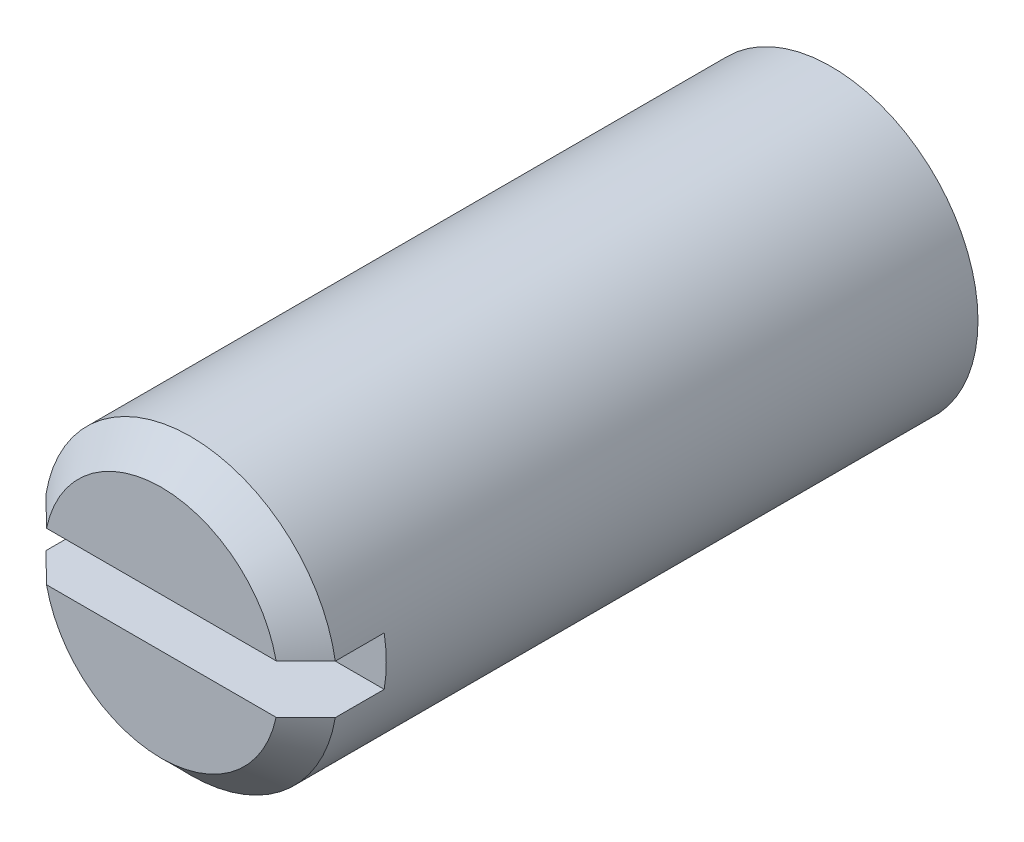
ISO-10303-21;
HEADER;
FILE_DESCRIPTION(('STEP AP214'),'2;1');
FILE_NAME('part.step','',(''),(''),'','','');
FILE_SCHEMA(('AUTOMOTIVE_DESIGN { 1 0 10303 214 1 1 1 1 }'));
ENDSEC;
DATA;
#1=APPLICATION_CONTEXT('core data for automotive mechanical design processes');
#2=APPLICATION_PROTOCOL_DEFINITION('international standard','automotive_design',2000,#1);
#3=PRODUCT_CONTEXT('',#1,'mechanical');
#4=PRODUCT('Part','Part','',(#3));
#5=PRODUCT_RELATED_PRODUCT_CATEGORY('part','',(#4));
#6=PRODUCT_DEFINITION_FORMATION('','',#4);
#7=PRODUCT_DEFINITION_CONTEXT('part definition',#1,'design');
#8=PRODUCT_DEFINITION('design','',#6,#7);
#9=PRODUCT_DEFINITION_SHAPE('','',#8);
#10=(LENGTH_UNIT() NAMED_UNIT(*) SI_UNIT(.MILLI.,.METRE.));
#11=(NAMED_UNIT(*) PLANE_ANGLE_UNIT() SI_UNIT($,.RADIAN.));
#12=(NAMED_UNIT(*) SI_UNIT($,.STERADIAN.) SOLID_ANGLE_UNIT());
#13=UNCERTAINTY_MEASURE_WITH_UNIT(LENGTH_MEASURE(1.E-05),#10,'distance_accuracy_value','');
#14=(GEOMETRIC_REPRESENTATION_CONTEXT(3) GLOBAL_UNCERTAINTY_ASSIGNED_CONTEXT((#13)) GLOBAL_UNIT_ASSIGNED_CONTEXT((#10,
#11,#12)) REPRESENTATION_CONTEXT('',''));
#15=CARTESIAN_POINT('',(0.,0.,0.));
#16=DIRECTION('',(0.,0.,1.));
#17=DIRECTION('',(1.,0.,0.));
#18=AXIS2_PLACEMENT_3D('',#15,#16,#17);
#19=CARTESIAN_POINT('',(0.,0.,0.));
#20=DIRECTION('',(0.,0.,1.));
#21=DIRECTION('',(1.,0.,0.));
#22=AXIS2_PLACEMENT_3D('',#19,#20,#21);
#23=PLANE('',#22);
#24=DIRECTION('',(1.,0.,0.));
#25=VECTOR('',#24,1.);
#26=CARTESIAN_POINT('',(-3.,-0.5,0.));
#27=LINE('',#26,#25);
#28=CARTESIAN_POINT('',(-2.3473389188611,-0.5,0.));
#29=VERTEX_POINT('',#28);
#30=CARTESIAN_POINT('',(2.3473389188611,-0.5,0.));
#31=VERTEX_POINT('',#30);
#32=EDGE_CURVE('E128',#29,#31,#27,.T.);
#33=ORIENTED_EDGE('',*,*,#32,.F.);
#34=CARTESIAN_POINT('',(0.,0.,0.));
#35=DIRECTION('',(0.,0.,1.));
#36=DIRECTION('',(1.,0.,0.));
#37=AXIS2_PLACEMENT_3D('',#34,#35,#36);
#38=CIRCLE('',#37,2.4);
#39=EDGE_CURVE('E173',#29,#31,#38,.T.);
#40=ORIENTED_EDGE('',*,*,#39,.T.);
#41=EDGE_LOOP('',(#33,#40));
#42=FACE_BOUND('',#41,.T.);
#43=ADVANCED_FACE('F35',(#42),#23,.T.);
#44=DIRECTION('',(1.,0.,0.));
#45=VECTOR('',#44,1.);
#46=CARTESIAN_POINT('',(-3.,0.5,0.));
#47=LINE('',#46,#45);
#48=CARTESIAN_POINT('',(-2.3473389188611,0.5,0.));
#49=VERTEX_POINT('',#48);
#50=CARTESIAN_POINT('',(2.3473389188611,0.5,0.));
#51=VERTEX_POINT('',#50);
#52=EDGE_CURVE('E105',#49,#51,#47,.T.);
#53=ORIENTED_EDGE('',*,*,#52,.T.);
#54=CARTESIAN_POINT('',(0.,0.,0.));
#55=DIRECTION('',(0.,0.,1.));
#56=DIRECTION('',(1.,0.,0.));
#57=AXIS2_PLACEMENT_3D('',#54,#55,#56);
#58=CIRCLE('',#57,2.4);
#59=EDGE_CURVE('E11',#51,#49,#58,.T.);
#60=ORIENTED_EDGE('',*,*,#59,.T.);
#61=EDGE_LOOP('',(#53,#60));
#62=FACE_BOUND('',#61,.T.);
#63=ADVANCED_FACE('F183',(#62),#23,.T.);
#64=CARTESIAN_POINT('',(0.,0.,-15.));
#65=DIRECTION('',(0.,0.,-1.));
#66=DIRECTION('',(-1.,0.,0.));
#67=AXIS2_PLACEMENT_3D('',#64,#65,#66);
#68=CYLINDRICAL_SURFACE('',#67,3.);
#69=DIRECTION('',(0.,0.,-1.));
#70=VECTOR('',#69,1.);
#71=CARTESIAN_POINT('',(2.95803989154981,-0.5,-15.));
#72=LINE('',#71,#70);
#73=CARTESIAN_POINT('',(2.95803989154981,-0.5,-0.600000000000003));
#74=VERTEX_POINT('',#73);
#75=CARTESIAN_POINT('',(2.95803989154981,-0.5,-1.6));
#76=VERTEX_POINT('',#75);
#77=EDGE_CURVE('E96',#74,#76,#72,.T.);
#78=ORIENTED_EDGE('',*,*,#77,.F.);
#79=CARTESIAN_POINT('',(0.,0.,-0.600000000000003));
#80=DIRECTION('',(0.,0.,1.));
#81=DIRECTION('',(1.,0.,0.));
#82=AXIS2_PLACEMENT_3D('',#79,#80,#81);
#83=CIRCLE('',#82,3.);
#84=CARTESIAN_POINT('',(-2.95803989154981,-0.5,-0.600000000000003));
#85=VERTEX_POINT('',#84);
#86=EDGE_CURVE('E139',#74,#85,#83,.F.);
#87=ORIENTED_EDGE('',*,*,#86,.T.);
#88=DIRECTION('',(0.,0.,-1.));
#89=VECTOR('',#88,1.);
#90=CARTESIAN_POINT('',(-2.95803989154981,-0.5,-15.));
#91=LINE('',#90,#89);
#92=CARTESIAN_POINT('',(-2.95803989154981,-0.5,-1.6));
#93=VERTEX_POINT('',#92);
#94=EDGE_CURVE('E113',#93,#85,#91,.F.);
#95=ORIENTED_EDGE('',*,*,#94,.F.);
#96=CARTESIAN_POINT('',(0.,0.,-1.6));
#97=DIRECTION('',(0.,0.,-1.));
#98=DIRECTION('',(-1.,0.,0.));
#99=AXIS2_PLACEMENT_3D('',#96,#97,#98);
#100=CIRCLE('',#99,3.);
#101=CARTESIAN_POINT('',(-2.95803989154981,0.5,-1.6));
#102=VERTEX_POINT('',#101);
#103=EDGE_CURVE('E97',#102,#93,#100,.F.);
#104=ORIENTED_EDGE('',*,*,#103,.F.);
#105=DIRECTION('',(0.,0.,-1.));
#106=VECTOR('',#105,1.);
#107=CARTESIAN_POINT('',(-2.95803989154981,0.5,-15.));
#108=LINE('',#107,#106);
#109=CARTESIAN_POINT('',(-2.95803989154981,0.5,-0.600000000000003));
#110=VERTEX_POINT('',#109);
#111=EDGE_CURVE('E85',#110,#102,#108,.T.);
#112=ORIENTED_EDGE('',*,*,#111,.F.);
#113=CARTESIAN_POINT('',(0.,0.,-0.600000000000003));
#114=DIRECTION('',(0.,0.,1.));
#115=DIRECTION('',(1.,0.,0.));
#116=AXIS2_PLACEMENT_3D('',#113,#114,#115);
#117=CIRCLE('',#116,3.);
#118=CARTESIAN_POINT('',(2.95803989154981,0.5,-0.600000000000003));
#119=VERTEX_POINT('',#118);
#120=EDGE_CURVE('E137',#110,#119,#117,.F.);
#121=ORIENTED_EDGE('',*,*,#120,.T.);
#122=DIRECTION('',(0.,0.,-1.));
#123=VECTOR('',#122,1.);
#124=CARTESIAN_POINT('',(2.95803989154981,0.5,-15.));
#125=LINE('',#124,#123);
#126=CARTESIAN_POINT('',(2.95803989154981,0.5,-1.6));
#127=VERTEX_POINT('',#126);
#128=EDGE_CURVE('E114',#127,#119,#125,.F.);
#129=ORIENTED_EDGE('',*,*,#128,.F.);
#130=EDGE_CURVE('E104',#76,#127,#100,.F.);
#131=ORIENTED_EDGE('',*,*,#130,.F.);
#132=EDGE_LOOP('',(#78,#87,#95,#104,#112,#121,#129,#131));
#133=FACE_BOUND('',#132,.T.);
#134=CARTESIAN_POINT('',(0.,0.,-13.7009618943233));
#135=DIRECTION('',(0.,0.,-1.));
#136=DIRECTION('',(-1.,0.,0.));
#137=AXIS2_PLACEMENT_3D('',#134,#135,#136);
#138=CIRCLE('',#137,3.);
#139=CARTESIAN_POINT('',(3.00000000000001,0.,-13.7009618943233));
#140=VERTEX_POINT('',#139);
#141=EDGE_CURVE('E118',#140,#140,#138,.T.);
#142=ORIENTED_EDGE('',*,*,#141,.F.);
#143=EDGE_LOOP('',(#142));
#144=FACE_BOUND('',#143,.T.);
#145=ADVANCED_FACE('F109',(#133,#144),#68,.T.);
#146=CARTESIAN_POINT('',(0.,0.,-15.));
#147=DIRECTION('',(0.,0.,1.));
#148=DIRECTION('',(1.,0.,0.));
#149=AXIS2_PLACEMENT_3D('',#146,#147,#148);
#150=CONICAL_SURFACE('',#149,0.75,1.04719755119659);
#151=CARTESIAN_POINT('',(0.,0.,-15.));
#152=DIRECTION('',(0.,0.,-1.));
#153=DIRECTION('',(-1.,0.,0.));
#154=AXIS2_PLACEMENT_3D('',#151,#152,#153);
#155=CIRCLE('',#154,0.75);
#156=CARTESIAN_POINT('',(0.750000000000005,0.,-15.));
#157=VERTEX_POINT('',#156);
#158=EDGE_CURVE('E120',#157,#157,#155,.T.);
#159=CARTESIAN_POINT('',(3.00000000000001,0.,-13.7009618943233));
#160=CARTESIAN_POINT('',(2.97656250000001,0.,-13.7144935412575));
#161=CARTESIAN_POINT('',(2.95312500000001,0.,-13.7280251881916));
#162=CARTESIAN_POINT('',(2.90625000000001,0.,-13.7550884820599));
#163=CARTESIAN_POINT('',(2.88281250000001,0.,-13.768620128994));
#164=CARTESIAN_POINT('',(2.83593750000001,0.,-13.7956834228623));
#165=CARTESIAN_POINT('',(2.81250000000001,0.,-13.8092150697964));
#166=CARTESIAN_POINT('',(2.76562500000001,0.,-13.8362783636646));
#167=CARTESIAN_POINT('',(2.74218750000001,0.,-13.8498100105988));
#168=CARTESIAN_POINT('',(2.69531250000001,0.,-13.876873304467));
#169=CARTESIAN_POINT('',(2.67187500000001,0.,-13.8904049514012));
#170=CARTESIAN_POINT('',(2.62500000000001,0.,-13.9174682452694));
#171=CARTESIAN_POINT('',(2.60156250000001,0.,-13.9309998922036));
#172=CARTESIAN_POINT('',(2.55468750000001,0.,-13.9580631860718));
#173=CARTESIAN_POINT('',(2.53125000000001,0.,-13.971594833006));
#174=CARTESIAN_POINT('',(2.48437500000001,0.,-13.9986581268742));
#175=CARTESIAN_POINT('',(2.46093750000001,0.,-14.0121897738084));
#176=CARTESIAN_POINT('',(2.41406250000001,0.,-14.0392530676766));
#177=CARTESIAN_POINT('',(2.39062500000001,0.,-14.0527847146108));
#178=CARTESIAN_POINT('',(2.34375000000001,0.,-14.079848008479));
#179=CARTESIAN_POINT('',(2.32031250000001,0.,-14.0933796554132));
#180=CARTESIAN_POINT('',(2.27343750000001,0.,-14.1204429492814));
#181=CARTESIAN_POINT('',(2.25000000000001,0.,-14.1339745962156));
#182=CARTESIAN_POINT('',(2.20312500000001,0.,-14.1610378900838));
#183=CARTESIAN_POINT('',(2.17968750000001,0.,-14.1745695370179));
#184=CARTESIAN_POINT('',(2.13281250000001,0.,-14.2016328308862));
#185=CARTESIAN_POINT('',(2.10937500000001,0.,-14.2151644778203));
#186=CARTESIAN_POINT('',(2.06250000000001,0.,-14.2422277716886));
#187=CARTESIAN_POINT('',(2.03906250000001,0.,-14.2557594186227));
#188=CARTESIAN_POINT('',(1.99218750000001,0.,-14.282822712491));
#189=CARTESIAN_POINT('',(1.96875000000001,0.,-14.2963543594251));
#190=CARTESIAN_POINT('',(1.92187500000001,0.,-14.3234176532934));
#191=CARTESIAN_POINT('',(1.89843750000001,0.,-14.3369493002275));
#192=CARTESIAN_POINT('',(1.85156250000001,0.,-14.3640125940958));
#193=CARTESIAN_POINT('',(1.82812500000001,0.,-14.3775442410299));
#194=CARTESIAN_POINT('',(1.78125000000001,0.,-14.4046075348982));
#195=CARTESIAN_POINT('',(1.75781250000001,0.,-14.4181391818323));
#196=CARTESIAN_POINT('',(1.71093750000001,0.,-14.4452024757006));
#197=CARTESIAN_POINT('',(1.68750000000001,0.,-14.4587341226347));
#198=CARTESIAN_POINT('',(1.64062500000001,0.,-14.485797416503));
#199=CARTESIAN_POINT('',(1.61718750000001,0.,-14.4993290634371));
#200=CARTESIAN_POINT('',(1.57031250000001,0.,-14.5263923573054));
#201=CARTESIAN_POINT('',(1.54687500000001,0.,-14.5399240042395));
#202=CARTESIAN_POINT('',(1.50000000000001,0.,-14.5669872981078));
#203=CARTESIAN_POINT('',(1.47656250000001,0.,-14.5805189450419));
#204=CARTESIAN_POINT('',(1.42968750000001,0.,-14.6075822389102));
#205=CARTESIAN_POINT('',(1.40625000000001,0.,-14.6211138858443));
#206=CARTESIAN_POINT('',(1.35937500000001,0.,-14.6481771797126));
#207=CARTESIAN_POINT('',(1.33593750000001,0.,-14.6617088266467));
#208=CARTESIAN_POINT('',(1.28906250000001,0.,-14.688772120515));
#209=CARTESIAN_POINT('',(1.26562500000001,0.,-14.7023037674491));
#210=CARTESIAN_POINT('',(1.21875000000001,0.,-14.7293670613174));
#211=CARTESIAN_POINT('',(1.19531250000001,0.,-14.7428987082515));
#212=CARTESIAN_POINT('',(1.14843750000001,0.,-14.7699620021198));
#213=CARTESIAN_POINT('',(1.12500000000001,0.,-14.7834936490539));
#214=CARTESIAN_POINT('',(1.07812500000001,0.,-14.8105569429222));
#215=CARTESIAN_POINT('',(1.05468750000001,0.,-14.8240885898563));
#216=CARTESIAN_POINT('',(1.00781250000001,0.,-14.8511518837245));
#217=CARTESIAN_POINT('',(0.984375000000005,0.,-14.8646835306587));
#218=CARTESIAN_POINT('',(0.937500000000005,0.,-14.8917468245269));
#219=CARTESIAN_POINT('',(0.914062500000005,0.,-14.9052784714611));
#220=CARTESIAN_POINT('',(0.867187500000005,0.,-14.9323417653293));
#221=CARTESIAN_POINT('',(0.843750000000005,0.,-14.9458734122635));
#222=CARTESIAN_POINT('',(0.796875000000005,0.,-14.9729367061317));
#223=CARTESIAN_POINT('',(0.773437500000005,0.,-14.9864683530659));
#224=CARTESIAN_POINT('',(0.750000000000005,0.,-15.));
#225=B_SPLINE_CURVE_WITH_KNOTS('',3,(#159,#160,#161,#162,#163,#164,#165,#166,#167,#168,#169,
#170,#171,#172,#173,#174,#175,#176,#177,#178,#179,#180,#181,#182,#183,#184,#185,#186,#187,#188,
#189,#190,#191,#192,#193,#194,#195,#196,#197,#198,#199,#200,#201,#202,#203,#204,#205,#206,#207,
#208,#209,#210,#211,#212,#213,#214,#215,#216,#217,#218,#219,#220,#221,#222,#223,#224),
.UNSPECIFIED.,.F.,.F.,(4,2,2,2,2,2,2,2,2,2,2,2,2,2,2,2,2,2,2,2,2,2,2,2,2,2,2,2,2,2,2,2,4),(0.,
0.0811898816047913,0.162379763209583,0.243569644814374,0.324759526419165,0.405949408023956,
0.487139289628748,0.568329171233539,0.64951905283833,0.730708934443122,0.811898816047913,
0.893088697652705,0.974278579257496,1.05546846086229,1.13665834246708,1.21784822407187,
1.29903810567666,1.38022798728145,1.46141786888625,1.54260775049104,1.62379763209583,
1.70498751370062,1.78617739530541,1.8673672769102,1.94855715851499,2.02974704011978,
2.11093692172458,2.19212680332937,2.27331668493416,2.35450656653895,2.43569644814374,
2.51688632974853,2.59807621135332),.UNSPECIFIED.);
#226=EDGE_CURVE('BSEAM190',#140,#157,#225,.T.);
#227=ORIENTED_EDGE('',*,*,#141,.T.);
#228=ORIENTED_EDGE('',*,*,#158,.F.);
#229=ORIENTED_EDGE('',*,*,#226,.T.);
#230=ORIENTED_EDGE('',*,*,#226,.F.);
#231=EDGE_LOOP('',(#227,#229,#228,#230));
#232=FACE_BOUND('',#231,.T.);
#233=ADVANCED_FACE('F190',(#232),#150,.T.);
#234=CARTESIAN_POINT('',(-0.749999999999996,0.,-15.));
#235=DIRECTION('',(0.,0.,-1.));
#236=DIRECTION('',(-1.,0.,0.));
#237=AXIS2_PLACEMENT_3D('',#234,#235,#236);
#238=PLANE('',#237);
#239=ORIENTED_EDGE('',*,*,#158,.T.);
#240=EDGE_LOOP('',(#239));
#241=FACE_BOUND('',#240,.T.);
#242=ADVANCED_FACE('F192',(#241),#238,.T.);
#243=CARTESIAN_POINT('',(-3.,0.5,-1.6));
#244=DIRECTION('',(0.,0.,-1.));
#245=DIRECTION('',(-1.,0.,0.));
#246=AXIS2_PLACEMENT_3D('',#243,#244,#245);
#247=PLANE('',#246);
#248=DIRECTION('',(1.,0.,0.));
#249=VECTOR('',#248,1.);
#250=CARTESIAN_POINT('',(-3.,-0.5,-1.6));
#251=LINE('',#250,#249);
#252=EDGE_CURVE('E124',#93,#76,#251,.T.);
#253=ORIENTED_EDGE('',*,*,#252,.T.);
#254=ORIENTED_EDGE('',*,*,#130,.T.);
#255=DIRECTION('',(1.,0.,0.));
#256=VECTOR('',#255,1.);
#257=CARTESIAN_POINT('',(-3.,0.5,-1.6));
#258=LINE('',#257,#256);
#259=EDGE_CURVE('E88',#102,#127,#258,.T.);
#260=ORIENTED_EDGE('',*,*,#259,.F.);
#261=ORIENTED_EDGE('',*,*,#103,.T.);
#262=EDGE_LOOP('',(#253,#254,#260,#261));
#263=FACE_BOUND('',#262,.T.);
#264=ADVANCED_FACE('F101',(#263),#247,.F.);
#265=CARTESIAN_POINT('',(-3.,-0.5,0.));
#266=DIRECTION('',(0.,-1.,0.));
#267=DIRECTION('',(0.,0.,-1.));
#268=AXIS2_PLACEMENT_3D('',#265,#266,#267);
#269=PLANE('',#268);
#270=ORIENTED_EDGE('',*,*,#94,.T.);
#271=CARTESIAN_POINT('',(-2.95803989154981,-0.5,-0.600000000000004));
#272=CARTESIAN_POINT('',(-2.85645630983513,-0.5,-0.499796543419297));
#273=CARTESIAN_POINT('',(-2.75477277691521,-0.5,-0.399694820669013));
#274=CARTESIAN_POINT('',(-2.55120578606336,-0.5,-0.199694820623831));
#275=CARTESIAN_POINT('',(-2.44932232808705,-0.5,-0.0997965433741134));
#276=CARTESIAN_POINT('',(-2.3473389188611,-0.5,0.));
#277=B_SPLINE_CURVE_WITH_KNOTS('',3,(#271,#272,#273,#274,#275,#276),.UNSPECIFIED.,.F.,.F.,(4,2,
4),(0.,0.428064319795368,0.856128734644408),.UNSPECIFIED.);
#278=EDGE_CURVE('E149',#85,#29,#277,.T.);
#279=ORIENTED_EDGE('',*,*,#278,.T.);
#280=ORIENTED_EDGE('',*,*,#32,.T.);
#281=CARTESIAN_POINT('',(2.3473389188611,-0.5,0.));
#282=CARTESIAN_POINT('',(2.44932232808705,-0.5,-0.0997965433741122));
#283=CARTESIAN_POINT('',(2.55120578606336,-0.5,-0.19969482062383));
#284=CARTESIAN_POINT('',(2.75477277691521,-0.5,-0.399694820669012));
#285=CARTESIAN_POINT('',(2.85645630983513,-0.5,-0.499796543419296));
#286=CARTESIAN_POINT('',(2.95803989154981,-0.5,-0.600000000000003));
#287=B_SPLINE_CURVE_WITH_KNOTS('',3,(#281,#282,#283,#284,#285,#286),.UNSPECIFIED.,.F.,.F.,(4,2,
4),(0.,0.42806441484904,0.856128734644408),.UNSPECIFIED.);
#288=EDGE_CURVE('E134',#31,#74,#287,.T.);
#289=ORIENTED_EDGE('',*,*,#288,.T.);
#290=ORIENTED_EDGE('',*,*,#77,.T.);
#291=ORIENTED_EDGE('',*,*,#252,.F.);
#292=EDGE_LOOP('',(#270,#279,#280,#289,#290,#291));
#293=FACE_BOUND('',#292,.T.);
#294=ADVANCED_FACE('F132',(#293),#269,.F.);
#295=CARTESIAN_POINT('',(-3.,0.5,0.));
#296=DIRECTION('',(0.,1.,0.));
#297=DIRECTION('',(0.,0.,1.));
#298=AXIS2_PLACEMENT_3D('',#295,#296,#297);
#299=PLANE('',#298);
#300=ORIENTED_EDGE('',*,*,#128,.T.);
#301=CARTESIAN_POINT('',(2.95803989154981,0.5,-0.600000000000003));
#302=CARTESIAN_POINT('',(2.85645630983513,0.5,-0.499796543419296));
#303=CARTESIAN_POINT('',(2.75477277691521,0.5,-0.399694820669012));
#304=CARTESIAN_POINT('',(2.55120578606336,0.5,-0.19969482062383));
#305=CARTESIAN_POINT('',(2.44932232808705,0.5,-0.0997965433741123));
#306=CARTESIAN_POINT('',(2.3473389188611,0.5,0.));
#307=B_SPLINE_CURVE_WITH_KNOTS('',3,(#301,#302,#303,#304,#305,#306),.UNSPECIFIED.,.F.,.F.,(4,2,
4),(0.,0.428064319795368,0.856128734644408),.UNSPECIFIED.);
#308=EDGE_CURVE('E44',#119,#51,#307,.T.);
#309=ORIENTED_EDGE('',*,*,#308,.T.);
#310=ORIENTED_EDGE('',*,*,#52,.F.);
#311=CARTESIAN_POINT('',(-2.3473389188611,0.5,0.));
#312=CARTESIAN_POINT('',(-2.44932232808705,0.5,-0.0997965433741133));
#313=CARTESIAN_POINT('',(-2.55120578606336,0.5,-0.199694820623831));
#314=CARTESIAN_POINT('',(-2.75477277691521,0.5,-0.399694820669013));
#315=CARTESIAN_POINT('',(-2.85645630983513,0.5,-0.499796543419297));
#316=CARTESIAN_POINT('',(-2.95803989154981,0.5,-0.600000000000004));
#317=B_SPLINE_CURVE_WITH_KNOTS('',3,(#311,#312,#313,#314,#315,#316),.UNSPECIFIED.,.F.,.F.,(4,2,
4),(0.,0.42806441484904,0.856128734644408),.UNSPECIFIED.);
#318=EDGE_CURVE('E91',#49,#110,#317,.T.);
#319=ORIENTED_EDGE('',*,*,#318,.T.);
#320=ORIENTED_EDGE('',*,*,#111,.T.);
#321=ORIENTED_EDGE('',*,*,#259,.T.);
#322=EDGE_LOOP('',(#300,#309,#310,#319,#320,#321));
#323=FACE_BOUND('',#322,.T.);
#324=ADVANCED_FACE('F87',(#323),#299,.F.);
#325=CARTESIAN_POINT('',(0.,0.,-0.600000000000003));
#326=DIRECTION('',(0.,0.,-1.));
#327=DIRECTION('',(-1.,0.,0.));
#328=AXIS2_PLACEMENT_3D('',#325,#326,#327);
#329=CONICAL_SURFACE('',#328,3.,0.78539816339745);
#330=ORIENTED_EDGE('',*,*,#288,.F.);
#331=ORIENTED_EDGE('',*,*,#39,.F.);
#332=ORIENTED_EDGE('',*,*,#278,.F.);
#333=ORIENTED_EDGE('',*,*,#86,.F.);
#334=EDGE_LOOP('',(#330,#331,#332,#333));
#335=FACE_BOUND('',#334,.T.);
#336=ADVANCED_FACE('F154',(#335),#329,.T.);
#337=CARTESIAN_POINT('',(0.,0.,-0.600000000000003));
#338=DIRECTION('',(0.,0.,-1.));
#339=DIRECTION('',(-1.,0.,0.));
#340=AXIS2_PLACEMENT_3D('',#337,#338,#339);
#341=CONICAL_SURFACE('',#340,3.,0.78539816339745);
#342=ORIENTED_EDGE('',*,*,#318,.F.);
#343=ORIENTED_EDGE('',*,*,#59,.F.);
#344=ORIENTED_EDGE('',*,*,#308,.F.);
#345=ORIENTED_EDGE('',*,*,#120,.F.);
#346=EDGE_LOOP('',(#342,#343,#344,#345));
#347=FACE_BOUND('',#346,.T.);
#348=ADVANCED_FACE('F37',(#347),#341,.T.);
#349=CLOSED_SHELL('',(#43,#63,#145,#233,#242,#264,#294,#324,#336,#348));
#350=MANIFOLD_SOLID_BREP('B2',#349);
#351=ADVANCED_BREP_SHAPE_REPRESENTATION('',(#18,#350),#14);
#352=SHAPE_DEFINITION_REPRESENTATION(#9,#351);
ENDSEC;
END-ISO-10303-21;
